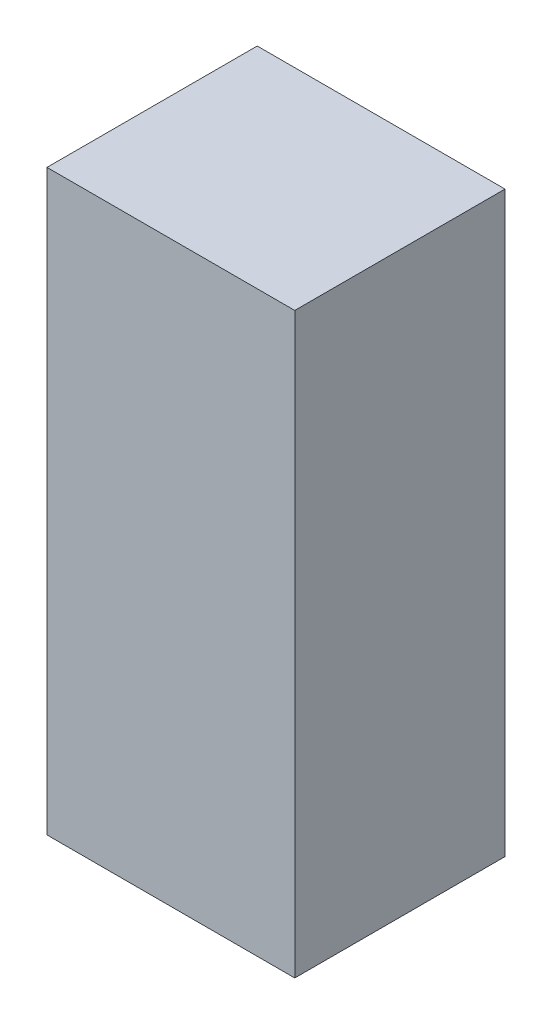
ISO-10303-21;
HEADER;
FILE_DESCRIPTION(('STEP AP214'),'2;1');
FILE_NAME('part.step','',(''),(''),'','','');
FILE_SCHEMA(('AUTOMOTIVE_DESIGN { 1 0 10303 214 1 1 1 1 }'));
ENDSEC;
DATA;
#1=APPLICATION_CONTEXT('core data for automotive mechanical design processes');
#2=APPLICATION_PROTOCOL_DEFINITION('international standard','automotive_design',2000,#1);
#3=PRODUCT_CONTEXT('',#1,'mechanical');
#4=PRODUCT('Part','Part','',(#3));
#5=PRODUCT_RELATED_PRODUCT_CATEGORY('part','',(#4));
#6=PRODUCT_DEFINITION_FORMATION('','',#4);
#7=PRODUCT_DEFINITION_CONTEXT('part definition',#1,'design');
#8=PRODUCT_DEFINITION('design','',#6,#7);
#9=PRODUCT_DEFINITION_SHAPE('','',#8);
#10=(LENGTH_UNIT() NAMED_UNIT(*) SI_UNIT(.MILLI.,.METRE.));
#11=(NAMED_UNIT(*) PLANE_ANGLE_UNIT() SI_UNIT($,.RADIAN.));
#12=(NAMED_UNIT(*) SI_UNIT($,.STERADIAN.) SOLID_ANGLE_UNIT());
#13=UNCERTAINTY_MEASURE_WITH_UNIT(LENGTH_MEASURE(1.E-05),#10,'distance_accuracy_value','');
#14=(GEOMETRIC_REPRESENTATION_CONTEXT(3) GLOBAL_UNCERTAINTY_ASSIGNED_CONTEXT((#13)) GLOBAL_UNIT_ASSIGNED_CONTEXT((#10,
#11,#12)) REPRESENTATION_CONTEXT('',''));
#15=CARTESIAN_POINT('',(0.,0.,0.));
#16=DIRECTION('',(0.,0.,1.));
#17=DIRECTION('',(1.,0.,0.));
#18=AXIS2_PLACEMENT_3D('',#15,#16,#17);
#19=CARTESIAN_POINT('',(0.,0.,28.));
#20=DIRECTION('',(0.,1.,0.));
#21=DIRECTION('',(0.,0.,1.));
#22=AXIS2_PLACEMENT_3D('',#19,#20,#21);
#23=PLANE('',#22);
#24=DIRECTION('',(1.,0.,0.));
#25=VECTOR('',#24,1.);
#26=CARTESIAN_POINT('',(0.,0.,0.));
#27=LINE('',#26,#25);
#28=CARTESIAN_POINT('',(-33.,0.,0.));
#29=VERTEX_POINT('',#28);
#30=CARTESIAN_POINT('',(0.,0.,0.));
#31=VERTEX_POINT('',#30);
#32=EDGE_CURVE('E102',#29,#31,#27,.T.);
#33=ORIENTED_EDGE('',*,*,#32,.T.);
#34=DIRECTION('',(0.,0.,-1.));
#35=VECTOR('',#34,1.);
#36=CARTESIAN_POINT('',(0.,0.,28.));
#37=LINE('',#36,#35);
#38=CARTESIAN_POINT('',(0.,0.,28.));
#39=VERTEX_POINT('',#38);
#40=EDGE_CURVE('E11',#39,#31,#37,.T.);
#41=ORIENTED_EDGE('',*,*,#40,.F.);
#42=DIRECTION('',(1.,0.,0.));
#43=VECTOR('',#42,1.);
#44=CARTESIAN_POINT('',(0.,0.,28.));
#45=LINE('',#44,#43);
#46=CARTESIAN_POINT('',(-33.,0.,28.));
#47=VERTEX_POINT('',#46);
#48=EDGE_CURVE('E90',#47,#39,#45,.T.);
#49=ORIENTED_EDGE('',*,*,#48,.F.);
#50=DIRECTION('',(0.,0.,-1.));
#51=VECTOR('',#50,1.);
#52=CARTESIAN_POINT('',(-33.,0.,28.));
#53=LINE('',#52,#51);
#54=EDGE_CURVE('E98',#47,#29,#53,.T.);
#55=ORIENTED_EDGE('',*,*,#54,.T.);
#56=EDGE_LOOP('',(#33,#41,#49,#55));
#57=FACE_BOUND('',#56,.T.);
#58=ADVANCED_FACE('F39',(#57),#23,.F.);
#59=CARTESIAN_POINT('',(0.,0.,28.));
#60=DIRECTION('',(-1.,0.,0.));
#61=DIRECTION('',(0.,0.,1.));
#62=AXIS2_PLACEMENT_3D('',#59,#60,#61);
#63=PLANE('',#62);
#64=DIRECTION('',(0.,1.,0.));
#65=VECTOR('',#64,1.);
#66=CARTESIAN_POINT('',(0.,0.,0.));
#67=LINE('',#66,#65);
#68=CARTESIAN_POINT('',(0.,77.,0.));
#69=VERTEX_POINT('',#68);
#70=EDGE_CURVE('E94',#31,#69,#67,.T.);
#71=ORIENTED_EDGE('',*,*,#70,.T.);
#72=DIRECTION('',(0.,0.,-1.));
#73=VECTOR('',#72,1.);
#74=CARTESIAN_POINT('',(0.,77.,28.));
#75=LINE('',#74,#73);
#76=CARTESIAN_POINT('',(0.,77.,28.));
#77=VERTEX_POINT('',#76);
#78=EDGE_CURVE('E47',#77,#69,#75,.T.);
#79=ORIENTED_EDGE('',*,*,#78,.F.);
#80=DIRECTION('',(0.,1.,0.));
#81=VECTOR('',#80,1.);
#82=CARTESIAN_POINT('',(0.,0.,28.));
#83=LINE('',#82,#81);
#84=EDGE_CURVE('E85',#39,#77,#83,.T.);
#85=ORIENTED_EDGE('',*,*,#84,.F.);
#86=ORIENTED_EDGE('',*,*,#40,.T.);
#87=EDGE_LOOP('',(#71,#79,#85,#86));
#88=FACE_BOUND('',#87,.T.);
#89=ADVANCED_FACE('F93',(#88),#63,.F.);
#90=CARTESIAN_POINT('',(0.,77.,28.));
#91=DIRECTION('',(0.,-1.,0.));
#92=DIRECTION('',(0.,0.,-1.));
#93=AXIS2_PLACEMENT_3D('',#90,#91,#92);
#94=PLANE('',#93);
#95=DIRECTION('',(-1.,0.,0.));
#96=VECTOR('',#95,1.);
#97=CARTESIAN_POINT('',(0.,77.,0.));
#98=LINE('',#97,#96);
#99=CARTESIAN_POINT('',(-33.,77.,0.));
#100=VERTEX_POINT('',#99);
#101=EDGE_CURVE('E72',#69,#100,#98,.T.);
#102=ORIENTED_EDGE('',*,*,#101,.T.);
#103=DIRECTION('',(0.,0.,-1.));
#104=VECTOR('',#103,1.);
#105=CARTESIAN_POINT('',(-33.,77.,28.));
#106=LINE('',#105,#104);
#107=CARTESIAN_POINT('',(-33.,77.,28.));
#108=VERTEX_POINT('',#107);
#109=EDGE_CURVE('E95',#108,#100,#106,.T.);
#110=ORIENTED_EDGE('',*,*,#109,.F.);
#111=DIRECTION('',(-1.,0.,0.));
#112=VECTOR('',#111,1.);
#113=CARTESIAN_POINT('',(0.,77.,28.));
#114=LINE('',#113,#112);
#115=EDGE_CURVE('E88',#77,#108,#114,.T.);
#116=ORIENTED_EDGE('',*,*,#115,.F.);
#117=ORIENTED_EDGE('',*,*,#78,.T.);
#118=EDGE_LOOP('',(#102,#110,#116,#117));
#119=FACE_BOUND('',#118,.T.);
#120=ADVANCED_FACE('F96',(#119),#94,.F.);
#121=CARTESIAN_POINT('',(-33.,0.,28.));
#122=DIRECTION('',(1.,0.,0.));
#123=DIRECTION('',(0.,0.,-1.));
#124=AXIS2_PLACEMENT_3D('',#121,#122,#123);
#125=PLANE('',#124);
#126=DIRECTION('',(0.,-1.,0.));
#127=VECTOR('',#126,1.);
#128=CARTESIAN_POINT('',(-33.,0.,0.));
#129=LINE('',#128,#127);
#130=EDGE_CURVE('E78',#100,#29,#129,.T.);
#131=ORIENTED_EDGE('',*,*,#130,.T.);
#132=ORIENTED_EDGE('',*,*,#54,.F.);
#133=DIRECTION('',(0.,-1.,0.));
#134=VECTOR('',#133,1.);
#135=CARTESIAN_POINT('',(-33.,0.,28.));
#136=LINE('',#135,#134);
#137=EDGE_CURVE('E55',#108,#47,#136,.T.);
#138=ORIENTED_EDGE('',*,*,#137,.F.);
#139=ORIENTED_EDGE('',*,*,#109,.T.);
#140=EDGE_LOOP('',(#131,#132,#138,#139));
#141=FACE_BOUND('',#140,.T.);
#142=ADVANCED_FACE('F109',(#141),#125,.F.);
#143=CARTESIAN_POINT('',(0.,0.,28.));
#144=DIRECTION('',(0.,0.,-1.));
#145=DIRECTION('',(-1.,0.,0.));
#146=AXIS2_PLACEMENT_3D('',#143,#144,#145);
#147=PLANE('',#146);
#148=ORIENTED_EDGE('',*,*,#48,.T.);
#149=ORIENTED_EDGE('',*,*,#84,.T.);
#150=ORIENTED_EDGE('',*,*,#115,.T.);
#151=ORIENTED_EDGE('',*,*,#137,.T.);
#152=EDGE_LOOP('',(#148,#149,#150,#151));
#153=FACE_BOUND('',#152,.T.);
#154=ADVANCED_FACE('F86',(#153),#147,.F.);
#155=CARTESIAN_POINT('',(0.,0.,0.));
#156=DIRECTION('',(0.,0.,-1.));
#157=DIRECTION('',(-1.,0.,0.));
#158=AXIS2_PLACEMENT_3D('',#155,#156,#157);
#159=PLANE('',#158);
#160=ORIENTED_EDGE('',*,*,#32,.F.);
#161=ORIENTED_EDGE('',*,*,#130,.F.);
#162=ORIENTED_EDGE('',*,*,#101,.F.);
#163=ORIENTED_EDGE('',*,*,#70,.F.);
#164=EDGE_LOOP('',(#160,#161,#162,#163));
#165=FACE_BOUND('',#164,.T.);
#166=ADVANCED_FACE('F112',(#165),#159,.T.);
#167=CLOSED_SHELL('',(#58,#89,#120,#142,#154,#166));
#168=MANIFOLD_SOLID_BREP('B2',#167);
#169=ADVANCED_BREP_SHAPE_REPRESENTATION('',(#18,#168),#14);
#170=SHAPE_DEFINITION_REPRESENTATION(#9,#169);
ENDSEC;
END-ISO-10303-21;
